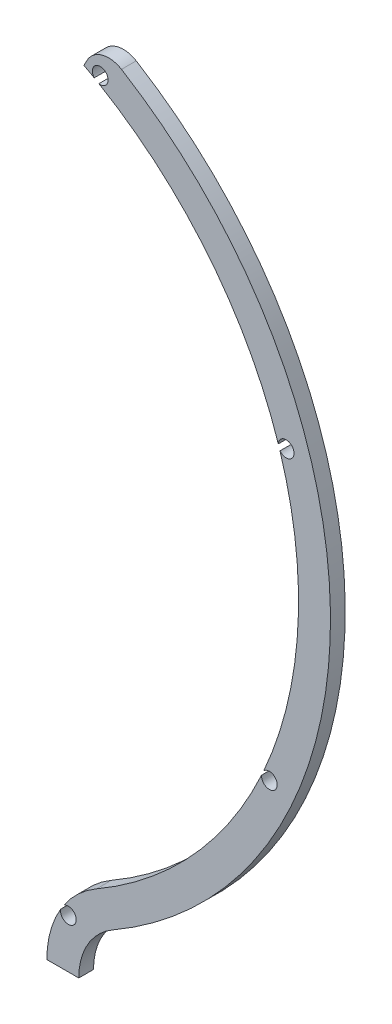
ISO-10303-21;
HEADER;
FILE_DESCRIPTION(('STEP AP214'),'2;1');
FILE_NAME('part.step','',(''),(''),'','','');
FILE_SCHEMA(('AUTOMOTIVE_DESIGN { 1 0 10303 214 1 1 1 1 }'));
ENDSEC;
DATA;
#1=APPLICATION_CONTEXT('core data for automotive mechanical design processes');
#2=APPLICATION_PROTOCOL_DEFINITION('international standard','automotive_design',2000,#1);
#3=PRODUCT_CONTEXT('',#1,'mechanical');
#4=PRODUCT('Part','Part','',(#3));
#5=PRODUCT_RELATED_PRODUCT_CATEGORY('part','',(#4));
#6=PRODUCT_DEFINITION_FORMATION('','',#4);
#7=PRODUCT_DEFINITION_CONTEXT('part definition',#1,'design');
#8=PRODUCT_DEFINITION('design','',#6,#7);
#9=PRODUCT_DEFINITION_SHAPE('','',#8);
#10=(LENGTH_UNIT() NAMED_UNIT(*) SI_UNIT(.MILLI.,.METRE.));
#11=(NAMED_UNIT(*) PLANE_ANGLE_UNIT() SI_UNIT($,.RADIAN.));
#12=(NAMED_UNIT(*) SI_UNIT($,.STERADIAN.) SOLID_ANGLE_UNIT());
#13=UNCERTAINTY_MEASURE_WITH_UNIT(LENGTH_MEASURE(1.E-05),#10,'distance_accuracy_value','');
#14=(GEOMETRIC_REPRESENTATION_CONTEXT(3) GLOBAL_UNCERTAINTY_ASSIGNED_CONTEXT((#13)) GLOBAL_UNIT_ASSIGNED_CONTEXT((#10,
#11,#12)) REPRESENTATION_CONTEXT('',''));
#15=CARTESIAN_POINT('',(0.,0.,0.));
#16=DIRECTION('',(0.,0.,1.));
#17=DIRECTION('',(1.,0.,0.));
#18=AXIS2_PLACEMENT_3D('',#15,#16,#17);
#19=CARTESIAN_POINT('',(0.,88.7564434701786,3.));
#20=DIRECTION('',(0.,0.,-1.));
#21=DIRECTION('',(-1.,0.,0.));
#22=AXIS2_PLACEMENT_3D('',#19,#20,#21);
#23=CYLINDRICAL_SURFACE('',#22,88.7435565298214);
#24=CARTESIAN_POINT('',(0.,88.7564434701786,0.));
#25=DIRECTION('',(0.,0.,1.));
#26=DIRECTION('',(1.,0.,0.));
#27=AXIS2_PLACEMENT_3D('',#24,#25,#26);
#28=CIRCLE('',#27,88.7435565298214);
#29=CARTESIAN_POINT('',(46.1965262908051,164.527808669867,0.));
#30=VERTEX_POINT('',#29);
#31=CARTESIAN_POINT('',(44.3717782649107,11.9022690931728,0.));
#32=VERTEX_POINT('',#31);
#33=EDGE_CURVE('E170',#30,#32,#28,.F.);
#34=ORIENTED_EDGE('',*,*,#33,.F.);
#35=DIRECTION('',(0.,0.,-1.));
#36=VECTOR('',#35,1.);
#37=CARTESIAN_POINT('',(46.1965262908051,164.527808669867,3.));
#38=LINE('',#37,#36);
#39=CARTESIAN_POINT('',(46.1965262908051,164.527808669867,3.));
#40=VERTEX_POINT('',#39);
#41=EDGE_CURVE('E11',#40,#30,#38,.T.);
#42=ORIENTED_EDGE('',*,*,#41,.F.);
#43=CARTESIAN_POINT('',(0.,88.7564434701786,3.));
#44=DIRECTION('',(0.,0.,1.));
#45=DIRECTION('',(1.,0.,0.));
#46=AXIS2_PLACEMENT_3D('',#43,#44,#45);
#47=CIRCLE('',#46,88.7435565298214);
#48=CARTESIAN_POINT('',(44.3717782649107,11.9022690931728,3.));
#49=VERTEX_POINT('',#48);
#50=EDGE_CURVE('E202',#40,#49,#47,.F.);
#51=ORIENTED_EDGE('',*,*,#50,.T.);
#52=DIRECTION('',(0.,0.,-1.));
#53=VECTOR('',#52,1.);
#54=CARTESIAN_POINT('',(44.3717782649107,11.9022690931728,3.));
#55=LINE('',#54,#53);
#56=EDGE_CURVE('E50',#49,#32,#55,.T.);
#57=ORIENTED_EDGE('',*,*,#56,.T.);
#58=EDGE_LOOP('',(#34,#42,#51,#57));
#59=FACE_BOUND('',#58,.T.);
#60=ADVANCED_FACE('F34',(#59),#23,.T.);
#61=CARTESIAN_POINT('',(43.5937161208474,160.258689414193,3.));
#62=DIRECTION('',(0.,0.,-1.));
#63=DIRECTION('',(-1.,0.,0.));
#64=AXIS2_PLACEMENT_3D('',#61,#62,#63);
#65=CYLINDRICAL_SURFACE('',#64,5.);
#66=CARTESIAN_POINT('',(43.5937161208474,160.258689414193,0.));
#67=DIRECTION('',(0.,0.,1.));
#68=DIRECTION('',(1.,0.,0.));
#69=AXIS2_PLACEMENT_3D('',#66,#67,#68);
#70=CIRCLE('',#69,5.);
#71=CARTESIAN_POINT('',(39.1768093643779,162.601963769589,0.));
#72=VERTEX_POINT('',#71);
#73=EDGE_CURVE('E172',#30,#72,#70,.T.);
#74=ORIENTED_EDGE('',*,*,#73,.T.);
#75=DIRECTION('',(0.,0.,-1.));
#76=VECTOR('',#75,1.);
#77=CARTESIAN_POINT('',(39.1768093643779,162.601963769589,3.));
#78=LINE('',#77,#76);
#79=CARTESIAN_POINT('',(39.1768093643779,162.601963769589,3.));
#80=VERTEX_POINT('',#79);
#81=EDGE_CURVE('E42',#80,#72,#78,.T.);
#82=ORIENTED_EDGE('',*,*,#81,.F.);
#83=CARTESIAN_POINT('',(43.5937161208474,160.258689414193,3.));
#84=DIRECTION('',(0.,0.,1.));
#85=DIRECTION('',(1.,0.,0.));
#86=AXIS2_PLACEMENT_3D('',#83,#84,#85);
#87=CIRCLE('',#86,5.);
#88=EDGE_CURVE('E252',#40,#80,#87,.T.);
#89=ORIENTED_EDGE('',*,*,#88,.F.);
#90=ORIENTED_EDGE('',*,*,#41,.T.);
#91=EDGE_LOOP('',(#74,#82,#89,#90));
#92=FACE_BOUND('',#91,.T.);
#93=ADVANCED_FACE('F285',(#92),#65,.T.);
#94=CARTESIAN_POINT('',(-36.7452539836833,19.4942334284821,3.));
#95=DIRECTION('',(0.883381351293905,-0.468654871079085,0.));
#96=DIRECTION('',(0.468654871079085,0.883381351293905,0.));
#97=AXIS2_PLACEMENT_3D('',#94,#95,#96);
#98=PLANE('',#97);
#99=DIRECTION('',(-0.468654871079085,-0.883381351293905,0.));
#100=VECTOR('',#99,1.);
#101=CARTESIAN_POINT('',(-36.7452539836833,19.4942334284821,0.));
#102=LINE('',#101,#100);
#103=CARTESIAN_POINT('',(38.5438433825688,161.408867572709,0.));
#104=VERTEX_POINT('',#103);
#105=EDGE_CURVE('E174',#72,#104,#102,.T.);
#106=ORIENTED_EDGE('',*,*,#105,.T.);
#107=DIRECTION('',(0.,0.,-1.));
#108=VECTOR('',#107,1.);
#109=CARTESIAN_POINT('',(38.5438433825688,161.408867572709,3.));
#110=LINE('',#109,#108);
#111=CARTESIAN_POINT('',(38.5438433825688,161.408867572709,3.));
#112=VERTEX_POINT('',#111);
#113=EDGE_CURVE('E223',#112,#104,#110,.T.);
#114=ORIENTED_EDGE('',*,*,#113,.F.);
#115=DIRECTION('',(-0.468654871079085,-0.883381351293905,0.));
#116=VECTOR('',#115,1.);
#117=CARTESIAN_POINT('',(-36.7452539836833,19.4942334284821,3.));
#118=LINE('',#117,#116);
#119=EDGE_CURVE('E232',#80,#112,#118,.T.);
#120=ORIENTED_EDGE('',*,*,#119,.F.);
#121=ORIENTED_EDGE('',*,*,#81,.T.);
#122=EDGE_LOOP('',(#106,#114,#120,#121));
#123=FACE_BOUND('',#122,.T.);
#124=ADVANCED_FACE('F230',(#123),#98,.F.);
#125=CARTESIAN_POINT('',(0.,88.7564434701786,3.));
#126=DIRECTION('',(0.,0.,-1.));
#127=DIRECTION('',(-1.,0.,0.));
#128=AXIS2_PLACEMENT_3D('',#125,#126,#127);
#129=CYLINDRICAL_SURFACE('',#128,82.2435565298214);
#130=CARTESIAN_POINT('',(0.,88.7564434701786,0.));
#131=DIRECTION('',(0.,0.,1.));
#132=DIRECTION('',(1.,0.,0.));
#133=AXIS2_PLACEMENT_3D('',#130,#131,#132);
#134=CIRCLE('',#133,82.2435565298214);
#135=CARTESIAN_POINT('',(40.6430108685143,160.25573198563,0.));
#136=VERTEX_POINT('',#135);
#137=EDGE_CURVE('E176',#104,#136,#134,.F.);
#138=ORIENTED_EDGE('',*,*,#137,.T.);
#139=DIRECTION('',(0.,0.,-1.));
#140=VECTOR('',#139,1.);
#141=CARTESIAN_POINT('',(40.6430108685143,160.25573198563,3.));
#142=LINE('',#141,#140);
#143=CARTESIAN_POINT('',(40.6430108685143,160.25573198563,3.));
#144=VERTEX_POINT('',#143);
#145=EDGE_CURVE('E221',#144,#136,#142,.T.);
#146=ORIENTED_EDGE('',*,*,#145,.F.);
#147=CARTESIAN_POINT('',(0.,88.7564434701786,3.));
#148=DIRECTION('',(0.,0.,1.));
#149=DIRECTION('',(1.,0.,0.));
#150=AXIS2_PLACEMENT_3D('',#147,#148,#149);
#151=CIRCLE('',#150,82.2435565298214);
#152=EDGE_CURVE('E245',#112,#144,#151,.F.);
#153=ORIENTED_EDGE('',*,*,#152,.F.);
#154=ORIENTED_EDGE('',*,*,#113,.T.);
#155=EDGE_LOOP('',(#138,#146,#153,#154));
#156=FACE_BOUND('',#155,.T.);
#157=ADVANCED_FACE('F242',(#156),#129,.F.);
#158=CARTESIAN_POINT('',(41.871778264911,161.280490828262,3.));
#159=DIRECTION('',(0.,0.,-1.));
#160=DIRECTION('',(-1.,0.,0.));
#161=AXIS2_PLACEMENT_3D('',#158,#159,#160);
#162=CYLINDRICAL_SURFACE('',#161,1.6);
#163=CARTESIAN_POINT('',(41.871778264911,161.280490828262,0.));
#164=DIRECTION('',(0.,0.,1.));
#165=DIRECTION('',(1.,0.,0.));
#166=AXIS2_PLACEMENT_3D('',#163,#164,#165);
#167=CIRCLE('',#166,1.6);
#168=CARTESIAN_POINT('',(41.5986947726374,159.703967626324,0.));
#169=VERTEX_POINT('',#168);
#170=EDGE_CURVE('E179',#169,#136,#167,.T.);
#171=ORIENTED_EDGE('',*,*,#170,.F.);
#172=DIRECTION('',(0.,0.,-1.));
#173=VECTOR('',#172,1.);
#174=CARTESIAN_POINT('',(41.5986947726374,159.703967626324,3.));
#175=LINE('',#174,#173);
#176=CARTESIAN_POINT('',(41.5986947726374,159.703967626324,3.));
#177=VERTEX_POINT('',#176);
#178=EDGE_CURVE('E219',#177,#169,#175,.T.);
#179=ORIENTED_EDGE('',*,*,#178,.F.);
#180=CARTESIAN_POINT('',(41.871778264911,161.280490828262,3.));
#181=DIRECTION('',(0.,0.,1.));
#182=DIRECTION('',(1.,0.,0.));
#183=AXIS2_PLACEMENT_3D('',#180,#181,#182);
#184=CIRCLE('',#183,1.6);
#185=EDGE_CURVE('E247',#177,#144,#184,.T.);
#186=ORIENTED_EDGE('',*,*,#185,.T.);
#187=ORIENTED_EDGE('',*,*,#145,.T.);
#188=EDGE_LOOP('',(#171,#179,#186,#187));
#189=FACE_BOUND('',#188,.T.);
#190=ADVANCED_FACE('F294',(#189),#162,.F.);
#191=CARTESIAN_POINT('',(78.1229590480099,114.462587876855,0.));
#192=VERTEX_POINT('',#191);
#193=EDGE_CURVE('E181',#169,#192,#134,.F.);
#194=ORIENTED_EDGE('',*,*,#193,.T.);
#195=DIRECTION('',(0.,0.,-1.));
#196=VECTOR('',#195,1.);
#197=CARTESIAN_POINT('',(78.1229590480099,114.462587876855,3.));
#198=LINE('',#197,#196);
#199=CARTESIAN_POINT('',(78.1229590480099,114.462587876855,3.));
#200=VERTEX_POINT('',#199);
#201=EDGE_CURVE('E217',#200,#192,#198,.T.);
#202=ORIENTED_EDGE('',*,*,#201,.F.);
#203=EDGE_CURVE('E250',#177,#200,#151,.F.);
#204=ORIENTED_EDGE('',*,*,#203,.F.);
#205=ORIENTED_EDGE('',*,*,#178,.T.);
#206=EDGE_LOOP('',(#194,#202,#204,#205));
#207=FACE_BOUND('',#206,.T.);
#208=ADVANCED_FACE('F297',(#207),#129,.F.);
#209=CARTESIAN_POINT('',(79.7216208092313,114.397161787194,3.));
#210=DIRECTION('',(0.,0.,-1.));
#211=DIRECTION('',(-1.,0.,0.));
#212=AXIS2_PLACEMENT_3D('',#209,#210,#211);
#213=CYLINDRICAL_SURFACE('',#212,1.60000000000001);
#214=CARTESIAN_POINT('',(79.7216208092313,114.397161787194,0.));
#215=DIRECTION('',(0.,0.,1.));
#216=DIRECTION('',(1.,0.,0.));
#217=AXIS2_PLACEMENT_3D('',#214,#215,#216);
#218=CIRCLE('',#217,1.60000000000001);
#219=CARTESIAN_POINT('',(78.4608390020166,113.412058120265,0.));
#220=VERTEX_POINT('',#219);
#221=EDGE_CURVE('E184',#220,#192,#218,.T.);
#222=ORIENTED_EDGE('',*,*,#221,.F.);
#223=DIRECTION('',(0.,0.,-1.));
#224=VECTOR('',#223,1.);
#225=CARTESIAN_POINT('',(78.4608390020166,113.412058120265,3.));
#226=LINE('',#225,#224);
#227=CARTESIAN_POINT('',(78.4608390020166,113.412058120265,3.));
#228=VERTEX_POINT('',#227);
#229=EDGE_CURVE('E215',#228,#220,#226,.T.);
#230=ORIENTED_EDGE('',*,*,#229,.F.);
#231=CARTESIAN_POINT('',(79.7216208092313,114.397161787194,3.));
#232=DIRECTION('',(0.,0.,1.));
#233=DIRECTION('',(1.,0.,0.));
#234=AXIS2_PLACEMENT_3D('',#231,#232,#233);
#235=CIRCLE('',#234,1.60000000000001);
#236=EDGE_CURVE('E256',#228,#200,#235,.T.);
#237=ORIENTED_EDGE('',*,*,#236,.T.);
#238=ORIENTED_EDGE('',*,*,#201,.T.);
#239=EDGE_LOOP('',(#222,#230,#237,#238));
#240=FACE_BOUND('',#239,.T.);
#241=ADVANCED_FACE('F299',(#240),#213,.F.);
#242=CARTESIAN_POINT('',(75.1582537640353,55.3612419913012,0.));
#243=VERTEX_POINT('',#242);
#244=EDGE_CURVE('E187',#220,#243,#134,.F.);
#245=ORIENTED_EDGE('',*,*,#244,.T.);
#246=DIRECTION('',(0.,0.,-1.));
#247=VECTOR('',#246,1.);
#248=CARTESIAN_POINT('',(75.1582537640353,55.3612419913012,3.));
#249=LINE('',#248,#247);
#250=CARTESIAN_POINT('',(75.1582537640353,55.3612419913012,3.));
#251=VERTEX_POINT('',#250);
#252=EDGE_CURVE('E213',#251,#243,#249,.T.);
#253=ORIENTED_EDGE('',*,*,#252,.F.);
#254=EDGE_CURVE('E255',#228,#251,#151,.F.);
#255=ORIENTED_EDGE('',*,*,#254,.F.);
#256=ORIENTED_EDGE('',*,*,#229,.T.);
#257=EDGE_LOOP('',(#245,#253,#255,#256));
#258=FACE_BOUND('',#257,.T.);
#259=ADVANCED_FACE('F302',(#258),#129,.F.);
#260=CARTESIAN_POINT('',(76.2991745607774,54.2395023889151,3.));
#261=DIRECTION('',(0.,0.,-1.));
#262=DIRECTION('',(-1.,0.,0.));
#263=AXIS2_PLACEMENT_3D('',#260,#261,#262);
#264=CYLINDRICAL_SURFACE('',#263,1.60000000000001);
#265=CARTESIAN_POINT('',(76.2991745607774,54.2395023889151,0.));
#266=DIRECTION('',(0.,0.,1.));
#267=DIRECTION('',(1.,0.,0.));
#268=AXIS2_PLACEMENT_3D('',#265,#266,#267);
#269=CIRCLE('',#268,1.60000000000001);
#270=CARTESIAN_POINT('',(74.7034075962799,54.3558114385138,0.));
#271=VERTEX_POINT('',#270);
#272=EDGE_CURVE('E188',#271,#243,#269,.T.);
#273=ORIENTED_EDGE('',*,*,#272,.F.);
#274=DIRECTION('',(0.,0.,-1.));
#275=VECTOR('',#274,1.);
#276=CARTESIAN_POINT('',(74.7034075962799,54.3558114385138,3.));
#277=LINE('',#276,#275);
#278=CARTESIAN_POINT('',(74.7034075962799,54.3558114385138,3.));
#279=VERTEX_POINT('',#278);
#280=EDGE_CURVE('E211',#279,#271,#277,.T.);
#281=ORIENTED_EDGE('',*,*,#280,.F.);
#282=CARTESIAN_POINT('',(76.2991745607774,54.2395023889151,3.));
#283=DIRECTION('',(0.,0.,1.));
#284=DIRECTION('',(1.,0.,0.));
#285=AXIS2_PLACEMENT_3D('',#282,#283,#284);
#286=CIRCLE('',#285,1.60000000000001);
#287=EDGE_CURVE('E254',#279,#251,#286,.T.);
#288=ORIENTED_EDGE('',*,*,#287,.T.);
#289=ORIENTED_EDGE('',*,*,#252,.T.);
#290=EDGE_LOOP('',(#273,#281,#288,#289));
#291=FACE_BOUND('',#290,.T.);
#292=ADVANCED_FACE('F304',(#291),#264,.F.);
#293=CARTESIAN_POINT('',(41.1217782649107,17.5314342177717,0.));
#294=VERTEX_POINT('',#293);
#295=EDGE_CURVE('E180',#271,#294,#134,.F.);
#296=ORIENTED_EDGE('',*,*,#295,.T.);
#297=DIRECTION('',(0.,0.,-1.));
#298=VECTOR('',#297,1.);
#299=CARTESIAN_POINT('',(41.1217782649107,17.5314342177717,3.));
#300=LINE('',#299,#298);
#301=CARTESIAN_POINT('',(41.1217782649107,17.5314342177717,3.));
#302=VERTEX_POINT('',#301);
#303=EDGE_CURVE('E208',#302,#294,#300,.T.);
#304=ORIENTED_EDGE('',*,*,#303,.F.);
#305=EDGE_CURVE('E249',#279,#302,#151,.F.);
#306=ORIENTED_EDGE('',*,*,#305,.F.);
#307=ORIENTED_EDGE('',*,*,#280,.T.);
#308=EDGE_LOOP('',(#296,#304,#306,#307));
#309=FACE_BOUND('',#308,.T.);
#310=ADVANCED_FACE('F307',(#309),#129,.F.);
#311=CARTESIAN_POINT('',(51.2435565298214,0.,3.));
#312=DIRECTION('',(0.,0.,-1.));
#313=DIRECTION('',(-1.,0.,0.));
#314=AXIS2_PLACEMENT_3D('',#311,#312,#313);
#315=CYLINDRICAL_SURFACE('',#314,20.2435565298214);
#316=CARTESIAN_POINT('',(51.2435565298214,0.,0.));
#317=DIRECTION('',(0.,0.,1.));
#318=DIRECTION('',(1.,0.,0.));
#319=AXIS2_PLACEMENT_3D('',#316,#317,#318);
#320=CIRCLE('',#319,20.2435565298214);
#321=CARTESIAN_POINT('',(34.4374376321424,11.2852092835335,0.));
#322=VERTEX_POINT('',#321);
#323=EDGE_CURVE('E191',#294,#322,#320,.T.);
#324=ORIENTED_EDGE('',*,*,#323,.T.);
#325=DIRECTION('',(0.,0.,-1.));
#326=VECTOR('',#325,1.);
#327=CARTESIAN_POINT('',(34.4374376321424,11.2852092835335,3.));
#328=LINE('',#327,#326);
#329=CARTESIAN_POINT('',(34.4374376321424,11.2852092835335,3.));
#330=VERTEX_POINT('',#329);
#331=EDGE_CURVE('E206',#330,#322,#328,.T.);
#332=ORIENTED_EDGE('',*,*,#331,.F.);
#333=CARTESIAN_POINT('',(51.2435565298214,0.,3.));
#334=DIRECTION('',(0.,0.,1.));
#335=DIRECTION('',(1.,0.,0.));
#336=AXIS2_PLACEMENT_3D('',#333,#334,#335);
#337=CIRCLE('',#336,20.2435565298214);
#338=EDGE_CURVE('E154',#302,#330,#337,.T.);
#339=ORIENTED_EDGE('',*,*,#338,.F.);
#340=ORIENTED_EDGE('',*,*,#303,.T.);
#341=EDGE_LOOP('',(#324,#332,#339,#340));
#342=FACE_BOUND('',#341,.T.);
#343=ADVANCED_FACE('F310',(#342),#315,.T.);
#344=CARTESIAN_POINT('',(35.3904523736439,10.,3.));
#345=DIRECTION('',(0.,0.,-1.));
#346=DIRECTION('',(-1.,0.,0.));
#347=AXIS2_PLACEMENT_3D('',#344,#345,#346);
#348=CYLINDRICAL_SURFACE('',#347,1.6);
#349=CARTESIAN_POINT('',(35.3904523736439,10.,0.));
#350=DIRECTION('',(0.,0.,1.));
#351=DIRECTION('',(1.,0.,0.));
#352=AXIS2_PLACEMENT_3D('',#349,#350,#351);
#353=CIRCLE('',#352,1.6);
#354=CARTESIAN_POINT('',(33.8200870066686,10.3065169068818,0.));
#355=VERTEX_POINT('',#354);
#356=EDGE_CURVE('E194',#355,#322,#353,.T.);
#357=ORIENTED_EDGE('',*,*,#356,.F.);
#358=DIRECTION('',(0.,0.,-1.));
#359=VECTOR('',#358,1.);
#360=CARTESIAN_POINT('',(33.8200870066686,10.3065169068818,3.));
#361=LINE('',#360,#359);
#362=CARTESIAN_POINT('',(33.8200870066686,10.3065169068818,3.));
#363=VERTEX_POINT('',#362);
#364=EDGE_CURVE('E162',#363,#355,#361,.T.);
#365=ORIENTED_EDGE('',*,*,#364,.F.);
#366=CARTESIAN_POINT('',(35.3904523736439,10.,3.));
#367=DIRECTION('',(0.,0.,1.));
#368=DIRECTION('',(1.,0.,0.));
#369=AXIS2_PLACEMENT_3D('',#366,#367,#368);
#370=CIRCLE('',#369,1.6);
#371=EDGE_CURVE('E151',#363,#330,#370,.T.);
#372=ORIENTED_EDGE('',*,*,#371,.T.);
#373=ORIENTED_EDGE('',*,*,#331,.T.);
#374=EDGE_LOOP('',(#357,#365,#372,#373));
#375=FACE_BOUND('',#374,.T.);
#376=ADVANCED_FACE('F272',(#375),#348,.F.);
#377=CARTESIAN_POINT('',(31.,0.,0.));
#378=VERTEX_POINT('',#377);
#379=EDGE_CURVE('E159',#355,#378,#320,.T.);
#380=ORIENTED_EDGE('',*,*,#379,.T.);
#381=DIRECTION('',(0.,0.,-1.));
#382=VECTOR('',#381,1.);
#383=CARTESIAN_POINT('',(31.,0.,3.));
#384=LINE('',#383,#382);
#385=CARTESIAN_POINT('',(31.,0.,3.));
#386=VERTEX_POINT('',#385);
#387=EDGE_CURVE('E156',#386,#378,#384,.T.);
#388=ORIENTED_EDGE('',*,*,#387,.F.);
#389=EDGE_CURVE('E143',#363,#386,#337,.T.);
#390=ORIENTED_EDGE('',*,*,#389,.F.);
#391=ORIENTED_EDGE('',*,*,#364,.T.);
#392=EDGE_LOOP('',(#380,#388,#390,#391));
#393=FACE_BOUND('',#392,.T.);
#394=ADVANCED_FACE('F157',(#393),#315,.T.);
#395=CARTESIAN_POINT('',(0.,0.,3.));
#396=DIRECTION('',(0.,1.,0.));
#397=DIRECTION('',(0.,0.,1.));
#398=AXIS2_PLACEMENT_3D('',#395,#396,#397);
#399=PLANE('',#398);
#400=DIRECTION('',(1.,0.,0.));
#401=VECTOR('',#400,1.);
#402=CARTESIAN_POINT('',(0.,0.,0.));
#403=LINE('',#402,#401);
#404=CARTESIAN_POINT('',(37.5,0.,0.));
#405=VERTEX_POINT('',#404);
#406=EDGE_CURVE('E197',#378,#405,#403,.T.);
#407=ORIENTED_EDGE('',*,*,#406,.T.);
#408=DIRECTION('',(0.,0.,-1.));
#409=VECTOR('',#408,1.);
#410=CARTESIAN_POINT('',(37.5,0.,3.));
#411=LINE('',#410,#409);
#412=CARTESIAN_POINT('',(37.5,0.,3.));
#413=VERTEX_POINT('',#412);
#414=EDGE_CURVE('E97',#413,#405,#411,.T.);
#415=ORIENTED_EDGE('',*,*,#414,.F.);
#416=DIRECTION('',(1.,0.,0.));
#417=VECTOR('',#416,1.);
#418=CARTESIAN_POINT('',(0.,0.,3.));
#419=LINE('',#418,#417);
#420=EDGE_CURVE('E149',#386,#413,#419,.T.);
#421=ORIENTED_EDGE('',*,*,#420,.F.);
#422=ORIENTED_EDGE('',*,*,#387,.T.);
#423=EDGE_LOOP('',(#407,#415,#421,#422));
#424=FACE_BOUND('',#423,.T.);
#425=ADVANCED_FACE('F164',(#424),#399,.F.);
#426=CARTESIAN_POINT('',(51.2435565298214,0.,3.));
#427=DIRECTION('',(0.,0.,-1.));
#428=DIRECTION('',(-1.,0.,0.));
#429=AXIS2_PLACEMENT_3D('',#426,#427,#428);
#430=CYLINDRICAL_SURFACE('',#429,13.7435565298214);
#431=CARTESIAN_POINT('',(51.2435565298214,0.,0.));
#432=DIRECTION('',(0.,0.,1.));
#433=DIRECTION('',(1.,0.,0.));
#434=AXIS2_PLACEMENT_3D('',#431,#432,#433);
#435=CIRCLE('',#434,13.7435565298214);
#436=EDGE_CURVE('E199',#32,#405,#435,.T.);
#437=ORIENTED_EDGE('',*,*,#436,.F.);
#438=ORIENTED_EDGE('',*,*,#56,.F.);
#439=CARTESIAN_POINT('',(51.2435565298214,0.,3.));
#440=DIRECTION('',(0.,0.,1.));
#441=DIRECTION('',(1.,0.,0.));
#442=AXIS2_PLACEMENT_3D('',#439,#440,#441);
#443=CIRCLE('',#442,13.7435565298214);
#444=EDGE_CURVE('E165',#49,#413,#443,.T.);
#445=ORIENTED_EDGE('',*,*,#444,.T.);
#446=ORIENTED_EDGE('',*,*,#414,.T.);
#447=EDGE_LOOP('',(#437,#438,#445,#446));
#448=FACE_BOUND('',#447,.T.);
#449=ADVANCED_FACE('F274',(#448),#430,.F.);
#450=CARTESIAN_POINT('',(0.,0.,3.));
#451=DIRECTION('',(0.,0.,1.));
#452=DIRECTION('',(1.,0.,0.));
#453=AXIS2_PLACEMENT_3D('',#450,#451,#452);
#454=PLANE('',#453);
#455=ORIENTED_EDGE('',*,*,#50,.F.);
#456=ORIENTED_EDGE('',*,*,#88,.T.);
#457=ORIENTED_EDGE('',*,*,#119,.T.);
#458=ORIENTED_EDGE('',*,*,#152,.T.);
#459=ORIENTED_EDGE('',*,*,#185,.F.);
#460=ORIENTED_EDGE('',*,*,#203,.T.);
#461=ORIENTED_EDGE('',*,*,#236,.F.);
#462=ORIENTED_EDGE('',*,*,#254,.T.);
#463=ORIENTED_EDGE('',*,*,#287,.F.);
#464=ORIENTED_EDGE('',*,*,#305,.T.);
#465=ORIENTED_EDGE('',*,*,#338,.T.);
#466=ORIENTED_EDGE('',*,*,#371,.F.);
#467=ORIENTED_EDGE('',*,*,#389,.T.);
#468=ORIENTED_EDGE('',*,*,#420,.T.);
#469=ORIENTED_EDGE('',*,*,#444,.F.);
#470=EDGE_LOOP('',(#455,#456,#457,#458,#459,#460,#461,#462,#463,#464,#465,#466,#467,#468,#469));
#471=FACE_BOUND('',#470,.T.);
#472=ADVANCED_FACE('F146',(#471),#454,.T.);
#473=CARTESIAN_POINT('',(0.,0.,0.));
#474=DIRECTION('',(0.,0.,1.));
#475=DIRECTION('',(1.,0.,0.));
#476=AXIS2_PLACEMENT_3D('',#473,#474,#475);
#477=PLANE('',#476);
#478=ORIENTED_EDGE('',*,*,#33,.T.);
#479=ORIENTED_EDGE('',*,*,#436,.T.);
#480=ORIENTED_EDGE('',*,*,#406,.F.);
#481=ORIENTED_EDGE('',*,*,#379,.F.);
#482=ORIENTED_EDGE('',*,*,#356,.T.);
#483=ORIENTED_EDGE('',*,*,#323,.F.);
#484=ORIENTED_EDGE('',*,*,#295,.F.);
#485=ORIENTED_EDGE('',*,*,#272,.T.);
#486=ORIENTED_EDGE('',*,*,#244,.F.);
#487=ORIENTED_EDGE('',*,*,#221,.T.);
#488=ORIENTED_EDGE('',*,*,#193,.F.);
#489=ORIENTED_EDGE('',*,*,#170,.T.);
#490=ORIENTED_EDGE('',*,*,#137,.F.);
#491=ORIENTED_EDGE('',*,*,#105,.F.);
#492=ORIENTED_EDGE('',*,*,#73,.F.);
#493=EDGE_LOOP('',(#478,#479,#480,#481,#482,#483,#484,#485,#486,#487,#488,#489,#490,#491,#492));
#494=FACE_BOUND('',#493,.T.);
#495=ADVANCED_FACE('F237',(#494),#477,.F.);
#496=CLOSED_SHELL('',(#60,#93,#124,#157,#190,#208,#241,#259,#292,#310,#343,#376,#394,#425,#449,
#472,#495));
#497=MANIFOLD_SOLID_BREP('B2',#496);
#498=ADVANCED_BREP_SHAPE_REPRESENTATION('',(#18,#497),#14);
#499=SHAPE_DEFINITION_REPRESENTATION(#9,#498);
ENDSEC;
END-ISO-10303-21;
